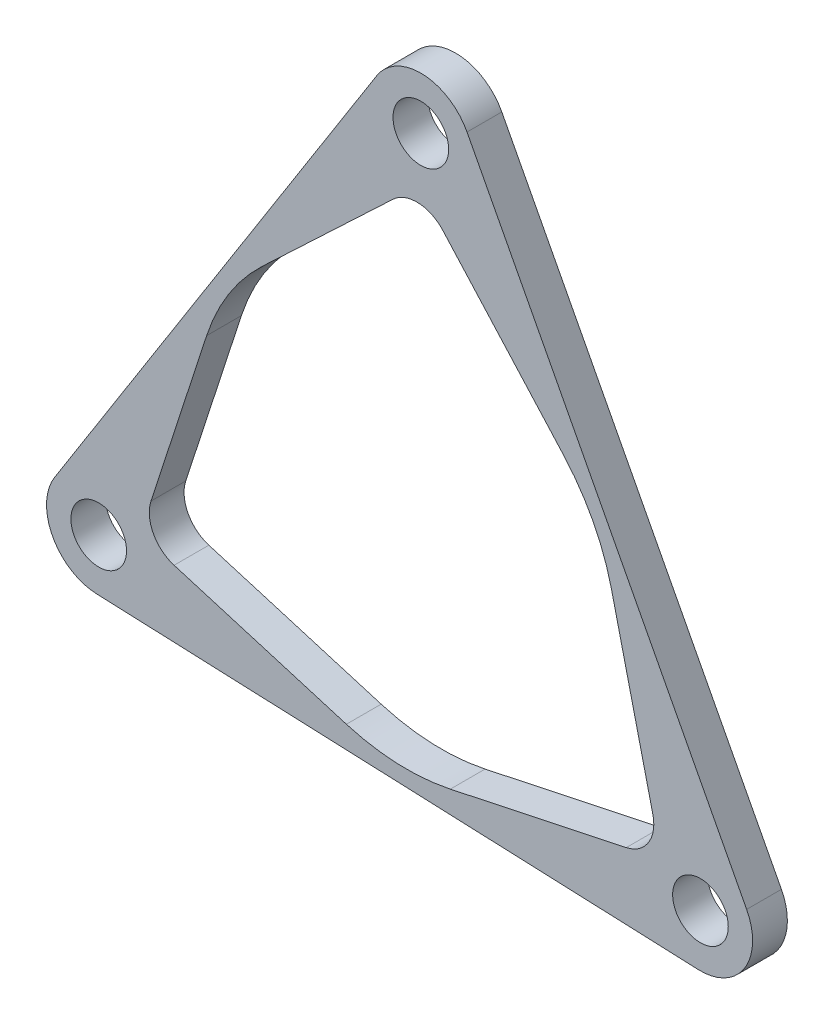
ISO-10303-21;
HEADER;
FILE_DESCRIPTION(('STEP AP214'),'2;1');
FILE_NAME('part.step','',(''),(''),'','','');
FILE_SCHEMA(('AUTOMOTIVE_DESIGN { 1 0 10303 214 1 1 1 1 }'));
ENDSEC;
DATA;
#1=APPLICATION_CONTEXT('core data for automotive mechanical design processes');
#2=APPLICATION_PROTOCOL_DEFINITION('international standard','automotive_design',2000,#1);
#3=PRODUCT_CONTEXT('',#1,'mechanical');
#4=PRODUCT('Part','Part','',(#3));
#5=PRODUCT_RELATED_PRODUCT_CATEGORY('part','',(#4));
#6=PRODUCT_DEFINITION_FORMATION('','',#4);
#7=PRODUCT_DEFINITION_CONTEXT('part definition',#1,'design');
#8=PRODUCT_DEFINITION('design','',#6,#7);
#9=PRODUCT_DEFINITION_SHAPE('','',#8);
#10=(LENGTH_UNIT() NAMED_UNIT(*) SI_UNIT(.MILLI.,.METRE.));
#11=(NAMED_UNIT(*) PLANE_ANGLE_UNIT() SI_UNIT($,.RADIAN.));
#12=(NAMED_UNIT(*) SI_UNIT($,.STERADIAN.) SOLID_ANGLE_UNIT());
#13=UNCERTAINTY_MEASURE_WITH_UNIT(LENGTH_MEASURE(1.E-05),#10,'distance_accuracy_value','');
#14=(GEOMETRIC_REPRESENTATION_CONTEXT(3) GLOBAL_UNCERTAINTY_ASSIGNED_CONTEXT((#13)) GLOBAL_UNIT_ASSIGNED_CONTEXT((#10,
#11,#12)) REPRESENTATION_CONTEXT('',''));
#15=CARTESIAN_POINT('',(0.,0.,0.));
#16=DIRECTION('',(0.,0.,1.));
#17=DIRECTION('',(1.,0.,0.));
#18=AXIS2_PLACEMENT_3D('',#15,#16,#17);
#19=CARTESIAN_POINT('',(-8.30616269572072,8.79873066255682,2.));
#20=DIRECTION('',(0.686459726919068,-0.727167823351803,0.));
#21=DIRECTION('',(0.727167823351803,0.686459726919068,0.));
#22=AXIS2_PLACEMENT_3D('',#19,#20,#21);
#23=PLANE('',#22);
#24=DIRECTION('',(-0.727167823351803,-0.686459726919068,0.));
#25=VECTOR('',#24,1.);
#26=CARTESIAN_POINT('',(-8.30616269572072,8.79873066255682,0.));
#27=LINE('',#26,#25);
#28=CARTESIAN_POINT('',(-0.783837106453981,15.8999436205264,0.));
#29=VERTEX_POINT('',#28);
#30=CARTESIAN_POINT('',(-8.30616269572072,8.79873066255682,0.));
#31=VERTEX_POINT('',#30);
#32=EDGE_CURVE('E269',#29,#31,#27,.T.);
#33=ORIENTED_EDGE('',*,*,#32,.F.);
#34=DIRECTION('',(0.,0.,-1.));
#35=VECTOR('',#34,1.);
#36=CARTESIAN_POINT('',(-0.783837106453981,15.8999436205264,2.));
#37=LINE('',#36,#35);
#38=CARTESIAN_POINT('',(-0.783837106453981,15.8999436205264,2.));
#39=VERTEX_POINT('',#38);
#40=EDGE_CURVE('E11',#39,#29,#37,.T.);
#41=ORIENTED_EDGE('',*,*,#40,.F.);
#42=DIRECTION('',(-0.727167823351803,-0.686459726919068,0.));
#43=VECTOR('',#42,1.);
#44=CARTESIAN_POINT('',(-8.30616269572072,8.79873066255682,2.));
#45=LINE('',#44,#43);
#46=CARTESIAN_POINT('',(-8.30616269572072,8.79873066255682,2.));
#47=VERTEX_POINT('',#46);
#48=EDGE_CURVE('E310',#39,#47,#45,.T.);
#49=ORIENTED_EDGE('',*,*,#48,.T.);
#50=DIRECTION('',(0.,0.,-1.));
#51=VECTOR('',#50,1.);
#52=CARTESIAN_POINT('',(-8.30616269572072,8.79873066255682,2.));
#53=LINE('',#52,#51);
#54=EDGE_CURVE('E54',#47,#31,#53,.T.);
#55=ORIENTED_EDGE('',*,*,#54,.T.);
#56=EDGE_LOOP('',(#33,#41,#49,#55));
#57=FACE_BOUND('',#56,.T.);
#58=ADVANCED_FACE('F35',(#57),#23,.T.);
#59=CARTESIAN_POINT('',(0.589082347384165,14.4456079738228,2.));
#60=DIRECTION('',(0.,0.,-1.));
#61=DIRECTION('',(-1.,0.,0.));
#62=AXIS2_PLACEMENT_3D('',#59,#60,#61);
#63=CYLINDRICAL_SURFACE('',#62,2.);
#64=CARTESIAN_POINT('',(0.589082347384165,14.4456079738228,0.));
#65=DIRECTION('',(0.,0.,1.));
#66=DIRECTION('',(1.,0.,0.));
#67=AXIS2_PLACEMENT_3D('',#64,#65,#66);
#68=CIRCLE('',#67,2.);
#69=CARTESIAN_POINT('',(2.07585994839131,15.7833270643435,0.));
#70=VERTEX_POINT('',#69);
#71=EDGE_CURVE('E266',#29,#70,#68,.F.);
#72=ORIENTED_EDGE('',*,*,#71,.T.);
#73=DIRECTION('',(0.,0.,-1.));
#74=VECTOR('',#73,1.);
#75=CARTESIAN_POINT('',(2.07585994839131,15.7833270643435,2.));
#76=LINE('',#75,#74);
#77=CARTESIAN_POINT('',(2.07585994839131,15.7833270643435,2.));
#78=VERTEX_POINT('',#77);
#79=EDGE_CURVE('E45',#78,#70,#76,.T.);
#80=ORIENTED_EDGE('',*,*,#79,.F.);
#81=CARTESIAN_POINT('',(0.589082347384165,14.4456079738228,2.));
#82=DIRECTION('',(0.,0.,1.));
#83=DIRECTION('',(1.,0.,0.));
#84=AXIS2_PLACEMENT_3D('',#81,#82,#83);
#85=CIRCLE('',#84,2.);
#86=EDGE_CURVE('E307',#39,#78,#85,.F.);
#87=ORIENTED_EDGE('',*,*,#86,.F.);
#88=ORIENTED_EDGE('',*,*,#40,.T.);
#89=EDGE_LOOP('',(#72,#80,#87,#88));
#90=FACE_BOUND('',#89,.T.);
#91=ADVANCED_FACE('F363',(#90),#63,.F.);
#92=CARTESIAN_POINT('',(8.99500448609315,8.09320049765011,2.));
#93=DIRECTION('',(0.743388800503566,0.66885954526034,0.));
#94=DIRECTION('',(-0.66885954526034,0.743388800503566,0.));
#95=AXIS2_PLACEMENT_3D('',#92,#93,#94);
#96=PLANE('',#95);
#97=DIRECTION('',(0.66885954526034,-0.743388800503566,0.));
#98=VECTOR('',#97,1.);
#99=CARTESIAN_POINT('',(8.99500448609315,8.09320049765011,0.));
#100=LINE('',#99,#98);
#101=CARTESIAN_POINT('',(8.99500448609315,8.09320049765012,0.));
#102=VERTEX_POINT('',#101);
#103=EDGE_CURVE('E263',#70,#102,#100,.T.);
#104=ORIENTED_EDGE('',*,*,#103,.T.);
#105=DIRECTION('',(0.,0.,-1.));
#106=VECTOR('',#105,1.);
#107=CARTESIAN_POINT('',(8.99500448609315,8.09320049765012,2.));
#108=LINE('',#107,#106);
#109=CARTESIAN_POINT('',(8.99500448609315,8.09320049765012,2.));
#110=VERTEX_POINT('',#109);
#111=EDGE_CURVE('E210',#110,#102,#108,.T.);
#112=ORIENTED_EDGE('',*,*,#111,.F.);
#113=DIRECTION('',(0.66885954526034,-0.743388800503566,0.));
#114=VECTOR('',#113,1.);
#115=CARTESIAN_POINT('',(8.99500448609315,8.09320049765011,2.));
#116=LINE('',#115,#114);
#117=EDGE_CURVE('E305',#78,#110,#116,.T.);
#118=ORIENTED_EDGE('',*,*,#117,.F.);
#119=ORIENTED_EDGE('',*,*,#79,.T.);
#120=EDGE_LOOP('',(#104,#112,#118,#119));
#121=FACE_BOUND('',#120,.T.);
#122=ADVANCED_FACE('F367',(#121),#96,.F.);
#123=CARTESIAN_POINT('',(0.,0.,2.));
#124=DIRECTION('',(0.,0.,-1.));
#125=DIRECTION('',(-1.,0.,0.));
#126=AXIS2_PLACEMENT_3D('',#123,#124,#125);
#127=CYLINDRICAL_SURFACE('',#126,12.1);
#128=CARTESIAN_POINT('',(0.,0.,0.));
#129=DIRECTION('',(0.,0.,1.));
#130=DIRECTION('',(1.,0.,0.));
#131=AXIS2_PLACEMENT_3D('',#128,#129,#130);
#132=CIRCLE('',#131,12.1);
#133=CARTESIAN_POINT('',(11.7730056226916,2.79398257118237,0.));
#134=VERTEX_POINT('',#133);
#135=EDGE_CURVE('E260',#134,#102,#132,.T.);
#136=ORIENTED_EDGE('',*,*,#135,.F.);
#137=DIRECTION('',(0.,0.,-1.));
#138=VECTOR('',#137,1.);
#139=CARTESIAN_POINT('',(11.7730056226916,2.79398257118237,2.));
#140=LINE('',#139,#138);
#141=CARTESIAN_POINT('',(11.7730056226916,2.79398257118237,2.));
#142=VERTEX_POINT('',#141);
#143=EDGE_CURVE('E208',#142,#134,#140,.T.);
#144=ORIENTED_EDGE('',*,*,#143,.F.);
#145=CARTESIAN_POINT('',(0.,0.,2.));
#146=DIRECTION('',(0.,0.,1.));
#147=DIRECTION('',(1.,0.,0.));
#148=AXIS2_PLACEMENT_3D('',#145,#146,#147);
#149=CIRCLE('',#148,12.1);
#150=EDGE_CURVE('E302',#142,#110,#149,.T.);
#151=ORIENTED_EDGE('',*,*,#150,.T.);
#152=ORIENTED_EDGE('',*,*,#111,.T.);
#153=EDGE_LOOP('',(#136,#144,#151,#152));
#154=FACE_BOUND('',#153,.T.);
#155=ADVANCED_FACE('F358',(#154),#127,.F.);
#156=CARTESIAN_POINT('',(11.7730056226916,2.79398257118238,2.));
#157=DIRECTION('',(0.97297567129683,0.230907650510941,0.));
#158=DIRECTION('',(-0.230907650510941,0.97297567129683,0.));
#159=AXIS2_PLACEMENT_3D('',#156,#157,#158);
#160=PLANE('',#159);
#161=DIRECTION('',(0.230907650510941,-0.97297567129683,0.));
#162=VECTOR('',#161,1.);
#163=CARTESIAN_POINT('',(11.7730056226916,2.79398257118238,0.));
#164=LINE('',#163,#162);
#165=CARTESIAN_POINT('',(14.1616736473432,-7.27114896364516,0.));
#166=VERTEX_POINT('',#165);
#167=EDGE_CURVE('E257',#134,#166,#164,.T.);
#168=ORIENTED_EDGE('',*,*,#167,.T.);
#169=DIRECTION('',(0.,0.,-1.));
#170=VECTOR('',#169,1.);
#171=CARTESIAN_POINT('',(14.1616736473432,-7.27114896364516,2.));
#172=LINE('',#171,#170);
#173=CARTESIAN_POINT('',(14.1616736473432,-7.27114896364516,2.));
#174=VERTEX_POINT('',#173);
#175=EDGE_CURVE('E205',#174,#166,#172,.T.);
#176=ORIENTED_EDGE('',*,*,#175,.F.);
#177=DIRECTION('',(0.230907650510941,-0.97297567129683,0.));
#178=VECTOR('',#177,1.);
#179=CARTESIAN_POINT('',(11.7730056226916,2.79398257118238,2.));
#180=LINE('',#179,#178);
#181=EDGE_CURVE('E299',#142,#174,#180,.T.);
#182=ORIENTED_EDGE('',*,*,#181,.F.);
#183=ORIENTED_EDGE('',*,*,#143,.T.);
#184=EDGE_LOOP('',(#168,#176,#182,#183));
#185=FACE_BOUND('',#184,.T.);
#186=ADVANCED_FACE('F374',(#185),#160,.F.);
#187=CARTESIAN_POINT('',(12.2157223047495,-7.73296426466705,2.));
#188=DIRECTION('',(0.,0.,-1.));
#189=DIRECTION('',(-1.,0.,0.));
#190=AXIS2_PLACEMENT_3D('',#187,#188,#189);
#191=CYLINDRICAL_SURFACE('',#190,2.);
#192=CARTESIAN_POINT('',(12.2157223047495,-7.73296426466705,0.));
#193=DIRECTION('',(0.,0.,1.));
#194=DIRECTION('',(1.,0.,0.));
#195=AXIS2_PLACEMENT_3D('',#192,#193,#194);
#196=CIRCLE('',#195,2.);
#197=CARTESIAN_POINT('',(12.6308322197643,-9.68941098217726,0.));
#198=VERTEX_POINT('',#197);
#199=EDGE_CURVE('E254',#166,#198,#196,.F.);
#200=ORIENTED_EDGE('',*,*,#199,.T.);
#201=DIRECTION('',(0.,0.,-1.));
#202=VECTOR('',#201,1.);
#203=CARTESIAN_POINT('',(12.6308322197643,-9.68941098217726,2.));
#204=LINE('',#203,#202);
#205=CARTESIAN_POINT('',(12.6308322197643,-9.68941098217726,2.));
#206=VERTEX_POINT('',#205);
#207=EDGE_CURVE('E202',#206,#198,#204,.T.);
#208=ORIENTED_EDGE('',*,*,#207,.F.);
#209=CARTESIAN_POINT('',(12.2157223047495,-7.73296426466705,2.));
#210=DIRECTION('',(0.,0.,1.));
#211=DIRECTION('',(1.,0.,0.));
#212=AXIS2_PLACEMENT_3D('',#209,#210,#211);
#213=CIRCLE('',#212,2.);
#214=EDGE_CURVE('E296',#174,#206,#213,.F.);
#215=ORIENTED_EDGE('',*,*,#214,.F.);
#216=ORIENTED_EDGE('',*,*,#175,.T.);
#217=EDGE_LOOP('',(#200,#208,#215,#216));
#218=FACE_BOUND('',#217,.T.);
#219=ADVANCED_FACE('F377',(#218),#191,.F.);
#220=CARTESIAN_POINT('',(2.51141498583928,-11.8365026409367,2.));
#221=DIRECTION('',(0.207554957507379,-0.978223358755101,0.));
#222=DIRECTION('',(0.978223358755101,0.207554957507379,0.));
#223=AXIS2_PLACEMENT_3D('',#220,#221,#222);
#224=PLANE('',#223);
#225=DIRECTION('',(-0.978223358755101,-0.207554957507379,0.));
#226=VECTOR('',#225,1.);
#227=CARTESIAN_POINT('',(2.51141498583928,-11.8365026409367,0.));
#228=LINE('',#227,#226);
#229=CARTESIAN_POINT('',(2.51141498583929,-11.8365026409367,0.));
#230=VERTEX_POINT('',#229);
#231=EDGE_CURVE('E251',#198,#230,#228,.T.);
#232=ORIENTED_EDGE('',*,*,#231,.T.);
#233=DIRECTION('',(0.,0.,-1.));
#234=VECTOR('',#233,1.);
#235=CARTESIAN_POINT('',(2.51141498583929,-11.8365026409367,2.));
#236=LINE('',#235,#234);
#237=CARTESIAN_POINT('',(2.51141498583929,-11.8365026409367,2.));
#238=VERTEX_POINT('',#237);
#239=EDGE_CURVE('E200',#238,#230,#236,.T.);
#240=ORIENTED_EDGE('',*,*,#239,.F.);
#241=DIRECTION('',(-0.978223358755101,-0.207554957507379,0.));
#242=VECTOR('',#241,1.);
#243=CARTESIAN_POINT('',(2.51141498583928,-11.8365026409367,2.));
#244=LINE('',#243,#242);
#245=EDGE_CURVE('E294',#206,#238,#244,.T.);
#246=ORIENTED_EDGE('',*,*,#245,.F.);
#247=ORIENTED_EDGE('',*,*,#207,.T.);
#248=EDGE_LOOP('',(#232,#240,#246,#247));
#249=FACE_BOUND('',#248,.T.);
#250=ADVANCED_FACE('F381',(#249),#224,.F.);
#251=CARTESIAN_POINT('',(-3.46684292697091,-11.5927132337392,0.));
#252=VERTEX_POINT('',#251);
#253=EDGE_CURVE('E250',#252,#230,#132,.T.);
#254=ORIENTED_EDGE('',*,*,#253,.F.);
#255=DIRECTION('',(0.,0.,-1.));
#256=VECTOR('',#255,1.);
#257=CARTESIAN_POINT('',(-3.46684292697091,-11.5927132337392,2.));
#258=LINE('',#257,#256);
#259=CARTESIAN_POINT('',(-3.46684292697091,-11.5927132337392,2.));
#260=VERTEX_POINT('',#259);
#261=EDGE_CURVE('E194',#260,#252,#258,.T.);
#262=ORIENTED_EDGE('',*,*,#261,.F.);
#263=EDGE_CURVE('E293',#260,#238,#149,.T.);
#264=ORIENTED_EDGE('',*,*,#263,.T.);
#265=ORIENTED_EDGE('',*,*,#239,.T.);
#266=EDGE_LOOP('',(#254,#262,#264,#265));
#267=FACE_BOUND('',#266,.T.);
#268=ADVANCED_FACE('F359',(#267),#127,.F.);
#269=CARTESIAN_POINT('',(-3.46684292697091,-11.5927132337392,2.));
#270=DIRECTION('',(-0.286515944377762,-0.958075473862743,0.));
#271=DIRECTION('',(0.958075473862743,-0.286515944377762,0.));
#272=AXIS2_PLACEMENT_3D('',#269,#270,#271);
#273=PLANE('',#272);
#274=DIRECTION('',(-0.958075473862743,0.286515944377762,0.));
#275=VECTOR('',#274,1.);
#276=CARTESIAN_POINT('',(-3.46684292697091,-11.5927132337392,0.));
#277=LINE('',#276,#275);
#278=CARTESIAN_POINT('',(-13.3778365408892,-8.62879465688125,0.));
#279=VERTEX_POINT('',#278);
#280=EDGE_CURVE('E247',#252,#279,#277,.T.);
#281=ORIENTED_EDGE('',*,*,#280,.T.);
#282=DIRECTION('',(0.,0.,-1.));
#283=VECTOR('',#282,1.);
#284=CARTESIAN_POINT('',(-13.3778365408892,-8.62879465688125,2.));
#285=LINE('',#284,#283);
#286=CARTESIAN_POINT('',(-13.3778365408892,-8.62879465688125,2.));
#287=VERTEX_POINT('',#286);
#288=EDGE_CURVE('E192',#287,#279,#285,.T.);
#289=ORIENTED_EDGE('',*,*,#288,.F.);
#290=DIRECTION('',(-0.958075473862743,0.286515944377762,0.));
#291=VECTOR('',#290,1.);
#292=CARTESIAN_POINT('',(-3.46684292697091,-11.5927132337392,2.));
#293=LINE('',#292,#291);
#294=EDGE_CURVE('E185',#260,#287,#293,.T.);
#295=ORIENTED_EDGE('',*,*,#294,.F.);
#296=ORIENTED_EDGE('',*,*,#261,.T.);
#297=EDGE_LOOP('',(#281,#289,#295,#296));
#298=FACE_BOUND('',#297,.T.);
#299=ADVANCED_FACE('F386',(#298),#273,.F.);
#300=CARTESIAN_POINT('',(-12.8048046521337,-6.71264370915576,2.));
#301=DIRECTION('',(0.,0.,-1.));
#302=DIRECTION('',(-1.,0.,0.));
#303=AXIS2_PLACEMENT_3D('',#300,#301,#302);
#304=CYLINDRICAL_SURFACE('',#303,2.);
#305=CARTESIAN_POINT('',(-12.8048046521337,-6.71264370915576,0.));
#306=DIRECTION('',(0.,0.,1.));
#307=DIRECTION('',(1.,0.,0.));
#308=AXIS2_PLACEMENT_3D('',#305,#306,#307);
#309=CIRCLE('',#308,2.);
#310=CARTESIAN_POINT('',(-14.7066921681556,-6.09391608216622,0.));
#311=VERTEX_POINT('',#310);
#312=EDGE_CURVE('E191',#279,#311,#309,.F.);
#313=ORIENTED_EDGE('',*,*,#312,.T.);
#314=DIRECTION('',(0.,0.,-1.));
#315=VECTOR('',#314,1.);
#316=CARTESIAN_POINT('',(-14.7066921681556,-6.09391608216622,2.));
#317=LINE('',#316,#315);
#318=CARTESIAN_POINT('',(-14.7066921681556,-6.09391608216622,2.));
#319=VERTEX_POINT('',#318);
#320=EDGE_CURVE('E172',#319,#311,#317,.T.);
#321=ORIENTED_EDGE('',*,*,#320,.F.);
#322=CARTESIAN_POINT('',(-12.8048046521337,-6.71264370915576,2.));
#323=DIRECTION('',(0.,0.,1.));
#324=DIRECTION('',(1.,0.,0.));
#325=AXIS2_PLACEMENT_3D('',#322,#323,#324);
#326=CIRCLE('',#325,2.);
#327=EDGE_CURVE('E177',#287,#319,#326,.F.);
#328=ORIENTED_EDGE('',*,*,#327,.F.);
#329=ORIENTED_EDGE('',*,*,#288,.T.);
#330=EDGE_LOOP('',(#313,#321,#328,#329));
#331=FACE_BOUND('',#330,.T.);
#332=ADVANCED_FACE('F190',(#331),#304,.F.);
#333=CARTESIAN_POINT('',(-11.5064194719324,3.74330214328661,2.));
#334=DIRECTION('',(-0.950943758010945,0.309363813494761,0.));
#335=DIRECTION('',(-0.309363813494761,-0.950943758010945,0.));
#336=AXIS2_PLACEMENT_3D('',#333,#334,#335);
#337=PLANE('',#336);
#338=DIRECTION('',(0.309363813494761,0.950943758010945,0.));
#339=VECTOR('',#338,1.);
#340=CARTESIAN_POINT('',(-11.5064194719324,3.74330214328661,0.));
#341=LINE('',#340,#339);
#342=CARTESIAN_POINT('',(-11.5064194719324,3.7433021432866,0.));
#343=VERTEX_POINT('',#342);
#344=EDGE_CURVE('E244',#311,#343,#341,.T.);
#345=ORIENTED_EDGE('',*,*,#344,.T.);
#346=DIRECTION('',(0.,0.,-1.));
#347=VECTOR('',#346,1.);
#348=CARTESIAN_POINT('',(-11.5064194719324,3.7433021432866,2.));
#349=LINE('',#348,#347);
#350=CARTESIAN_POINT('',(-11.5064194719324,3.7433021432866,2.));
#351=VERTEX_POINT('',#350);
#352=EDGE_CURVE('E110',#351,#343,#349,.T.);
#353=ORIENTED_EDGE('',*,*,#352,.F.);
#354=DIRECTION('',(0.309363813494761,0.950943758010945,0.));
#355=VECTOR('',#354,1.);
#356=CARTESIAN_POINT('',(-11.5064194719324,3.74330214328661,2.));
#357=LINE('',#356,#355);
#358=EDGE_CURVE('E168',#319,#351,#357,.T.);
#359=ORIENTED_EDGE('',*,*,#358,.F.);
#360=ORIENTED_EDGE('',*,*,#320,.T.);
#361=EDGE_LOOP('',(#345,#353,#359,#360));
#362=FACE_BOUND('',#361,.T.);
#363=ADVANCED_FACE('F170',(#362),#337,.F.);
#364=CARTESIAN_POINT('',(-0.529691166276595,-12.9892042584744,2.));
#365=DIRECTION('',(0.0407454743289689,0.999169558344182,0.));
#366=DIRECTION('',(-0.999169558344182,0.0407454743289689,0.));
#367=AXIS2_PLACEMENT_3D('',#364,#365,#366);
#368=PLANE('',#367);
#369=DIRECTION('',(0.999169558344182,-0.0407454743289689,0.));
#370=VECTOR('',#369,1.);
#371=CARTESIAN_POINT('',(-0.529691166276595,-12.9892042584744,0.));
#372=LINE('',#371,#370);
#373=CARTESIAN_POINT('',(-17.8358155705606,-12.2834719413116,0.));
#374=VERTEX_POINT('',#373);
#375=CARTESIAN_POINT('',(16.7764332380074,-13.6949365756371,0.));
#376=VERTEX_POINT('',#375);
#377=EDGE_CURVE('E282',#374,#376,#372,.T.);
#378=ORIENTED_EDGE('',*,*,#377,.T.);
#379=DIRECTION('',(0.,0.,-1.));
#380=VECTOR('',#379,1.);
#381=CARTESIAN_POINT('',(16.7764332380074,-13.6949365756371,2.));
#382=LINE('',#381,#380);
#383=CARTESIAN_POINT('',(16.7764332380074,-13.6949365756371,2.));
#384=VERTEX_POINT('',#383);
#385=EDGE_CURVE('E39',#384,#376,#382,.T.);
#386=ORIENTED_EDGE('',*,*,#385,.F.);
#387=DIRECTION('',(0.999169558344182,-0.0407454743289689,0.));
#388=VECTOR('',#387,1.);
#389=CARTESIAN_POINT('',(-0.529691166276595,-12.9892042584744,2.));
#390=LINE('',#389,#388);
#391=CARTESIAN_POINT('',(-17.8358155705606,-12.2834719413116,2.));
#392=VERTEX_POINT('',#391);
#393=EDGE_CURVE('E236',#392,#384,#390,.T.);
#394=ORIENTED_EDGE('',*,*,#393,.F.);
#395=DIRECTION('',(0.,0.,-1.));
#396=VECTOR('',#395,1.);
#397=CARTESIAN_POINT('',(-17.8358155705606,-12.2834719413116,2.));
#398=LINE('',#397,#396);
#399=EDGE_CURVE('E214',#392,#374,#398,.T.);
#400=ORIENTED_EDGE('',*,*,#399,.T.);
#401=EDGE_LOOP('',(#378,#386,#394,#400));
#402=FACE_BOUND('',#401,.T.);
#403=ADVANCED_FACE('F37',(#402),#368,.F.);
#404=CARTESIAN_POINT('',(16.8986696609943,-10.6974279006045,2.));
#405=DIRECTION('',(0.,0.,-1.));
#406=DIRECTION('',(-1.,0.,0.));
#407=AXIS2_PLACEMENT_3D('',#404,#405,#406);
#408=CYLINDRICAL_SURFACE('',#407,3.);
#409=CARTESIAN_POINT('',(16.8986696609943,-10.6974279006045,0.));
#410=DIRECTION('',(0.,0.,1.));
#411=DIRECTION('',(1.,0.,0.));
#412=AXIS2_PLACEMENT_3D('',#409,#410,#411);
#413=CIRCLE('',#412,3.);
#414=CARTESIAN_POINT('',(19.5557065331301,-9.30453341066259,0.));
#415=VERTEX_POINT('',#414);
#416=EDGE_CURVE('E280',#376,#415,#413,.T.);
#417=ORIENTED_EDGE('',*,*,#416,.T.);
#418=DIRECTION('',(0.,0.,-1.));
#419=VECTOR('',#418,1.);
#420=CARTESIAN_POINT('',(19.5557065331301,-9.30453341066259,2.));
#421=LINE('',#420,#419);
#422=CARTESIAN_POINT('',(19.5557065331301,-9.30453341066259,2.));
#423=VERTEX_POINT('',#422);
#424=EDGE_CURVE('E225',#423,#415,#421,.T.);
#425=ORIENTED_EDGE('',*,*,#424,.F.);
#426=CARTESIAN_POINT('',(16.8986696609943,-10.6974279006045,2.));
#427=DIRECTION('',(0.,0.,1.));
#428=DIRECTION('',(1.,0.,0.));
#429=AXIS2_PLACEMENT_3D('',#426,#427,#428);
#430=CIRCLE('',#429,3.);
#431=EDGE_CURVE('E123',#384,#423,#430,.T.);
#432=ORIENTED_EDGE('',*,*,#431,.F.);
#433=ORIENTED_EDGE('',*,*,#385,.T.);
#434=EDGE_LOOP('',(#417,#425,#432,#433));
#435=FACE_BOUND('',#434,.T.);
#436=ADVANCED_FACE('F334',(#435),#408,.T.);
#437=CARTESIAN_POINT('',(11.5138264459224,6.03587612308203,2.));
#438=DIRECTION('',(0.88567895737861,0.464298163313984,0.));
#439=DIRECTION('',(-0.464298163313984,0.88567895737861,0.));
#440=AXIS2_PLACEMENT_3D('',#437,#438,#439);
#441=PLANE('',#440);
#442=DIRECTION('',(0.464298163313984,-0.88567895737861,0.));
#443=VECTOR('',#442,1.);
#444=CARTESIAN_POINT('',(11.5138264459224,6.03587612308203,0.));
#445=LINE('',#444,#443);
#446=CARTESIAN_POINT('',(3.47194635871521,21.3762856568256,0.));
#447=VERTEX_POINT('',#446);
#448=EDGE_CURVE('E277',#447,#415,#445,.T.);
#449=ORIENTED_EDGE('',*,*,#448,.F.);
#450=DIRECTION('',(0.,0.,-1.));
#451=VECTOR('',#450,1.);
#452=CARTESIAN_POINT('',(3.47194635871521,21.3762856568256,2.));
#453=LINE('',#452,#451);
#454=CARTESIAN_POINT('',(3.47194635871521,21.3762856568256,2.));
#455=VERTEX_POINT('',#454);
#456=EDGE_CURVE('E224',#455,#447,#453,.T.);
#457=ORIENTED_EDGE('',*,*,#456,.F.);
#458=DIRECTION('',(0.464298163313984,-0.88567895737861,0.));
#459=VECTOR('',#458,1.);
#460=CARTESIAN_POINT('',(11.5138264459224,6.03587612308203,2.));
#461=LINE('',#460,#459);
#462=EDGE_CURVE('E318',#455,#423,#461,.T.);
#463=ORIENTED_EDGE('',*,*,#462,.T.);
#464=ORIENTED_EDGE('',*,*,#424,.T.);
#465=EDGE_LOOP('',(#449,#457,#463,#464));
#466=FACE_BOUND('',#465,.T.);
#467=ADVANCED_FACE('F335',(#466),#441,.T.);
#468=CARTESIAN_POINT('',(0.814909486579385,19.9833911668836,2.));
#469=DIRECTION('',(0.,0.,-1.));
#470=DIRECTION('',(-1.,0.,0.));
#471=AXIS2_PLACEMENT_3D('',#468,#469,#470);
#472=CYLINDRICAL_SURFACE('',#471,3.);
#473=CARTESIAN_POINT('',(0.814909486579385,19.9833911668836,0.));
#474=DIRECTION('',(0.,0.,1.));
#475=DIRECTION('',(1.,0.,0.));
#476=AXIS2_PLACEMENT_3D('',#473,#474,#475);
#477=CIRCLE('',#476,3.);
#478=CARTESIAN_POINT('',(-1.71989096256953,21.5880053519744,0.));
#479=VERTEX_POINT('',#478);
#480=EDGE_CURVE('E275',#447,#479,#477,.T.);
#481=ORIENTED_EDGE('',*,*,#480,.T.);
#482=DIRECTION('',(0.,0.,-1.));
#483=VECTOR('',#482,1.);
#484=CARTESIAN_POINT('',(-1.71989096256953,21.5880053519744,2.));
#485=LINE('',#484,#483);
#486=CARTESIAN_POINT('',(-1.71989096256953,21.5880053519744,2.));
#487=VERTEX_POINT('',#486);
#488=EDGE_CURVE('E221',#487,#479,#485,.T.);
#489=ORIENTED_EDGE('',*,*,#488,.F.);
#490=CARTESIAN_POINT('',(0.814909486579385,19.9833911668836,2.));
#491=DIRECTION('',(0.,0.,1.));
#492=DIRECTION('',(1.,0.,0.));
#493=AXIS2_PLACEMENT_3D('',#490,#491,#492);
#494=CIRCLE('',#493,3.);
#495=EDGE_CURVE('E316',#455,#487,#494,.T.);
#496=ORIENTED_EDGE('',*,*,#495,.F.);
#497=ORIENTED_EDGE('',*,*,#456,.T.);
#498=EDGE_LOOP('',(#481,#489,#496,#497));
#499=FACE_BOUND('',#498,.T.);
#500=ADVANCED_FACE('F341',(#499),#472,.T.);
#501=CARTESIAN_POINT('',(-10.9841352796458,6.95332813539354,2.));
#502=DIRECTION('',(0.844933483049638,-0.534871395030251,0.));
#503=DIRECTION('',(0.534871395030251,0.844933483049638,0.));
#504=AXIS2_PLACEMENT_3D('',#501,#502,#503);
#505=PLANE('',#504);
#506=DIRECTION('',(-0.534871395030251,-0.844933483049638,0.));
#507=VECTOR('',#506,1.);
#508=CARTESIAN_POINT('',(-10.9841352796458,6.95332813539354,0.));
#509=LINE('',#508,#507);
#510=CARTESIAN_POINT('',(-20.2483795967226,-7.68134908118834,0.));
#511=VERTEX_POINT('',#510);
#512=EDGE_CURVE('E273',#479,#511,#509,.T.);
#513=ORIENTED_EDGE('',*,*,#512,.T.);
#514=DIRECTION('',(0.,0.,-1.));
#515=VECTOR('',#514,1.);
#516=CARTESIAN_POINT('',(-20.2483795967226,-7.68134908118834,2.));
#517=LINE('',#516,#515);
#518=CARTESIAN_POINT('',(-20.2483795967226,-7.68134908118834,2.));
#519=VERTEX_POINT('',#518);
#520=EDGE_CURVE('E217',#519,#511,#517,.T.);
#521=ORIENTED_EDGE('',*,*,#520,.F.);
#522=DIRECTION('',(-0.534871395030251,-0.844933483049638,0.));
#523=VECTOR('',#522,1.);
#524=CARTESIAN_POINT('',(-10.9841352796458,6.95332813539354,2.));
#525=LINE('',#524,#523);
#526=EDGE_CURVE('E314',#487,#519,#525,.T.);
#527=ORIENTED_EDGE('',*,*,#526,.F.);
#528=ORIENTED_EDGE('',*,*,#488,.T.);
#529=EDGE_LOOP('',(#513,#521,#527,#528));
#530=FACE_BOUND('',#529,.T.);
#531=ADVANCED_FACE('F343',(#530),#505,.F.);
#532=CARTESIAN_POINT('',(0.814909486579385,19.9833911668836,2.));
#533=DIRECTION('',(0.,0.,-1.));
#534=DIRECTION('',(-1.,0.,0.));
#535=AXIS2_PLACEMENT_3D('',#532,#533,#534);
#536=CYLINDRICAL_SURFACE('',#535,1.6);
#537=CARTESIAN_POINT('',(0.814909486579385,19.9833911668836,2.));
#538=DIRECTION('',(0.,0.,1.));
#539=DIRECTION('',(1.,0.,0.));
#540=AXIS2_PLACEMENT_3D('',#537,#538,#539);
#541=CIRCLE('',#540,1.6);
#542=CARTESIAN_POINT('',(2.41490948657939,19.9833911668836,2.));
#543=VERTEX_POINT('',#542);
#544=EDGE_CURVE('E286',#543,#543,#541,.T.);
#545=ORIENTED_EDGE('',*,*,#544,.T.);
#546=EDGE_LOOP('',(#545));
#547=FACE_BOUND('',#546,.T.);
#548=CARTESIAN_POINT('',(0.814909486579385,19.9833911668836,0.));
#549=DIRECTION('',(0.,0.,1.));
#550=DIRECTION('',(1.,0.,0.));
#551=AXIS2_PLACEMENT_3D('',#548,#549,#550);
#552=CIRCLE('',#551,1.6);
#553=CARTESIAN_POINT('',(2.41490948657939,19.9833911668836,0.));
#554=VERTEX_POINT('',#553);
#555=EDGE_CURVE('E237',#554,#554,#552,.T.);
#556=ORIENTED_EDGE('',*,*,#555,.F.);
#557=EDGE_LOOP('',(#556));
#558=FACE_BOUND('',#557,.T.);
#559=ADVANCED_FACE('F396',(#547,#558),#536,.F.);
#560=CARTESIAN_POINT('',(-17.7135791475737,-9.28596326627909,2.));
#561=DIRECTION('',(0.,0.,-1.));
#562=DIRECTION('',(-1.,0.,0.));
#563=AXIS2_PLACEMENT_3D('',#560,#561,#562);
#564=CYLINDRICAL_SURFACE('',#563,1.6);
#565=CARTESIAN_POINT('',(-17.7135791475737,-9.28596326627909,2.));
#566=DIRECTION('',(0.,0.,1.));
#567=DIRECTION('',(1.,0.,0.));
#568=AXIS2_PLACEMENT_3D('',#565,#566,#567);
#569=CIRCLE('',#568,1.6);
#570=CARTESIAN_POINT('',(-16.1135791475737,-9.28596326627909,2.));
#571=VERTEX_POINT('',#570);
#572=EDGE_CURVE('E289',#571,#571,#569,.T.);
#573=ORIENTED_EDGE('',*,*,#572,.T.);
#574=EDGE_LOOP('',(#573));
#575=FACE_BOUND('',#574,.T.);
#576=CARTESIAN_POINT('',(-17.7135791475737,-9.28596326627909,0.));
#577=DIRECTION('',(0.,0.,1.));
#578=DIRECTION('',(1.,0.,0.));
#579=AXIS2_PLACEMENT_3D('',#576,#577,#578);
#580=CIRCLE('',#579,1.6);
#581=CARTESIAN_POINT('',(-16.1135791475737,-9.28596326627909,0.));
#582=VERTEX_POINT('',#581);
#583=EDGE_CURVE('E240',#582,#582,#580,.T.);
#584=ORIENTED_EDGE('',*,*,#583,.F.);
#585=EDGE_LOOP('',(#584));
#586=FACE_BOUND('',#585,.T.);
#587=ADVANCED_FACE('F356',(#575,#586),#564,.F.);
#588=EDGE_CURVE('E243',#31,#343,#132,.T.);
#589=ORIENTED_EDGE('',*,*,#588,.F.);
#590=ORIENTED_EDGE('',*,*,#54,.F.);
#591=EDGE_CURVE('E176',#47,#351,#149,.T.);
#592=ORIENTED_EDGE('',*,*,#591,.T.);
#593=ORIENTED_EDGE('',*,*,#352,.T.);
#594=EDGE_LOOP('',(#589,#590,#592,#593));
#595=FACE_BOUND('',#594,.T.);
#596=ADVANCED_FACE('F348',(#595),#127,.F.);
#597=CARTESIAN_POINT('',(-17.7135791475737,-9.28596326627909,2.));
#598=DIRECTION('',(0.,0.,-1.));
#599=DIRECTION('',(-1.,0.,0.));
#600=AXIS2_PLACEMENT_3D('',#597,#598,#599);
#601=CYLINDRICAL_SURFACE('',#600,3.);
#602=CARTESIAN_POINT('',(-17.7135791475737,-9.28596326627909,0.));
#603=DIRECTION('',(0.,0.,1.));
#604=DIRECTION('',(1.,0.,0.));
#605=AXIS2_PLACEMENT_3D('',#602,#603,#604);
#606=CIRCLE('',#605,3.);
#607=EDGE_CURVE('E271',#511,#374,#606,.T.);
#608=ORIENTED_EDGE('',*,*,#607,.T.);
#609=ORIENTED_EDGE('',*,*,#399,.F.);
#610=CARTESIAN_POINT('',(-17.7135791475737,-9.28596326627909,2.));
#611=DIRECTION('',(0.,0.,1.));
#612=DIRECTION('',(1.,0.,0.));
#613=AXIS2_PLACEMENT_3D('',#610,#611,#612);
#614=CIRCLE('',#613,3.);
#615=EDGE_CURVE('E312',#519,#392,#614,.T.);
#616=ORIENTED_EDGE('',*,*,#615,.F.);
#617=ORIENTED_EDGE('',*,*,#520,.T.);
#618=EDGE_LOOP('',(#608,#609,#616,#617));
#619=FACE_BOUND('',#618,.T.);
#620=ADVANCED_FACE('F345',(#619),#601,.T.);
#621=CARTESIAN_POINT('',(16.8986696609943,-10.6974279006045,2.));
#622=DIRECTION('',(0.,0.,-1.));
#623=DIRECTION('',(-1.,0.,0.));
#624=AXIS2_PLACEMENT_3D('',#621,#622,#623);
#625=CYLINDRICAL_SURFACE('',#624,1.6);
#626=CARTESIAN_POINT('',(16.8986696609943,-10.6974279006045,2.));
#627=DIRECTION('',(0.,0.,1.));
#628=DIRECTION('',(1.,0.,0.));
#629=AXIS2_PLACEMENT_3D('',#626,#627,#628);
#630=CIRCLE('',#629,1.6);
#631=CARTESIAN_POINT('',(18.4986696609943,-10.6974279006045,2.));
#632=VERTEX_POINT('',#631);
#633=EDGE_CURVE('E218',#632,#632,#630,.T.);
#634=ORIENTED_EDGE('',*,*,#633,.T.);
#635=EDGE_LOOP('',(#634));
#636=FACE_BOUND('',#635,.T.);
#637=CARTESIAN_POINT('',(16.8986696609943,-10.6974279006045,0.));
#638=DIRECTION('',(0.,0.,1.));
#639=DIRECTION('',(1.,0.,0.));
#640=AXIS2_PLACEMENT_3D('',#637,#638,#639);
#641=CIRCLE('',#640,1.6);
#642=CARTESIAN_POINT('',(18.4986696609943,-10.6974279006045,0.));
#643=VERTEX_POINT('',#642);
#644=EDGE_CURVE('E233',#643,#643,#641,.T.);
#645=ORIENTED_EDGE('',*,*,#644,.F.);
#646=EDGE_LOOP('',(#645));
#647=FACE_BOUND('',#646,.T.);
#648=ADVANCED_FACE('F347',(#636,#647),#625,.F.);
#649=CARTESIAN_POINT('',(0.,0.,2.));
#650=DIRECTION('',(0.,0.,1.));
#651=DIRECTION('',(1.,0.,0.));
#652=AXIS2_PLACEMENT_3D('',#649,#650,#651);
#653=PLANE('',#652);
#654=ORIENTED_EDGE('',*,*,#393,.T.);
#655=ORIENTED_EDGE('',*,*,#431,.T.);
#656=ORIENTED_EDGE('',*,*,#462,.F.);
#657=ORIENTED_EDGE('',*,*,#495,.T.);
#658=ORIENTED_EDGE('',*,*,#526,.T.);
#659=ORIENTED_EDGE('',*,*,#615,.T.);
#660=EDGE_LOOP('',(#654,#655,#656,#657,#658,#659));
#661=FACE_BOUND('',#660,.T.);
#662=ORIENTED_EDGE('',*,*,#48,.F.);
#663=ORIENTED_EDGE('',*,*,#86,.T.);
#664=ORIENTED_EDGE('',*,*,#117,.T.);
#665=ORIENTED_EDGE('',*,*,#150,.F.);
#666=ORIENTED_EDGE('',*,*,#181,.T.);
#667=ORIENTED_EDGE('',*,*,#214,.T.);
#668=ORIENTED_EDGE('',*,*,#245,.T.);
#669=ORIENTED_EDGE('',*,*,#263,.F.);
#670=ORIENTED_EDGE('',*,*,#294,.T.);
#671=ORIENTED_EDGE('',*,*,#327,.T.);
#672=ORIENTED_EDGE('',*,*,#358,.T.);
#673=ORIENTED_EDGE('',*,*,#591,.F.);
#674=EDGE_LOOP('',(#662,#663,#664,#665,#666,#667,#668,#669,#670,#671,#672,#673));
#675=FACE_BOUND('',#674,.T.);
#676=ORIENTED_EDGE('',*,*,#572,.F.);
#677=EDGE_LOOP('',(#676));
#678=FACE_BOUND('',#677,.T.);
#679=ORIENTED_EDGE('',*,*,#544,.F.);
#680=EDGE_LOOP('',(#679));
#681=FACE_BOUND('',#680,.T.);
#682=ORIENTED_EDGE('',*,*,#633,.F.);
#683=EDGE_LOOP('',(#682));
#684=FACE_BOUND('',#683,.T.);
#685=ADVANCED_FACE('F181',(#661,#675,#678,#681,#684),#653,.T.);
#686=CARTESIAN_POINT('',(0.,0.,0.));
#687=DIRECTION('',(0.,0.,1.));
#688=DIRECTION('',(1.,0.,0.));
#689=AXIS2_PLACEMENT_3D('',#686,#687,#688);
#690=PLANE('',#689);
#691=ORIENTED_EDGE('',*,*,#377,.F.);
#692=ORIENTED_EDGE('',*,*,#607,.F.);
#693=ORIENTED_EDGE('',*,*,#512,.F.);
#694=ORIENTED_EDGE('',*,*,#480,.F.);
#695=ORIENTED_EDGE('',*,*,#448,.T.);
#696=ORIENTED_EDGE('',*,*,#416,.F.);
#697=EDGE_LOOP('',(#691,#692,#693,#694,#695,#696));
#698=FACE_BOUND('',#697,.T.);
#699=ORIENTED_EDGE('',*,*,#32,.T.);
#700=ORIENTED_EDGE('',*,*,#588,.T.);
#701=ORIENTED_EDGE('',*,*,#344,.F.);
#702=ORIENTED_EDGE('',*,*,#312,.F.);
#703=ORIENTED_EDGE('',*,*,#280,.F.);
#704=ORIENTED_EDGE('',*,*,#253,.T.);
#705=ORIENTED_EDGE('',*,*,#231,.F.);
#706=ORIENTED_EDGE('',*,*,#199,.F.);
#707=ORIENTED_EDGE('',*,*,#167,.F.);
#708=ORIENTED_EDGE('',*,*,#135,.T.);
#709=ORIENTED_EDGE('',*,*,#103,.F.);
#710=ORIENTED_EDGE('',*,*,#71,.F.);
#711=EDGE_LOOP('',(#699,#700,#701,#702,#703,#704,#705,#706,#707,#708,#709,#710));
#712=FACE_BOUND('',#711,.T.);
#713=ORIENTED_EDGE('',*,*,#583,.T.);
#714=EDGE_LOOP('',(#713));
#715=FACE_BOUND('',#714,.T.);
#716=ORIENTED_EDGE('',*,*,#555,.T.);
#717=EDGE_LOOP('',(#716));
#718=FACE_BOUND('',#717,.T.);
#719=ORIENTED_EDGE('',*,*,#644,.T.);
#720=EDGE_LOOP('',(#719));
#721=FACE_BOUND('',#720,.T.);
#722=ADVANCED_FACE('F330',(#698,#712,#715,#718,#721),#690,.F.);
#723=CLOSED_SHELL('',(#58,#91,#122,#155,#186,#219,#250,#268,#299,#332,#363,#403,#436,#467,#500,
#531,#559,#587,#596,#620,#648,#685,#722));
#724=MANIFOLD_SOLID_BREP('B2',#723);
#725=ADVANCED_BREP_SHAPE_REPRESENTATION('',(#18,#724),#14);
#726=SHAPE_DEFINITION_REPRESENTATION(#9,#725);
ENDSEC;
END-ISO-10303-21;
